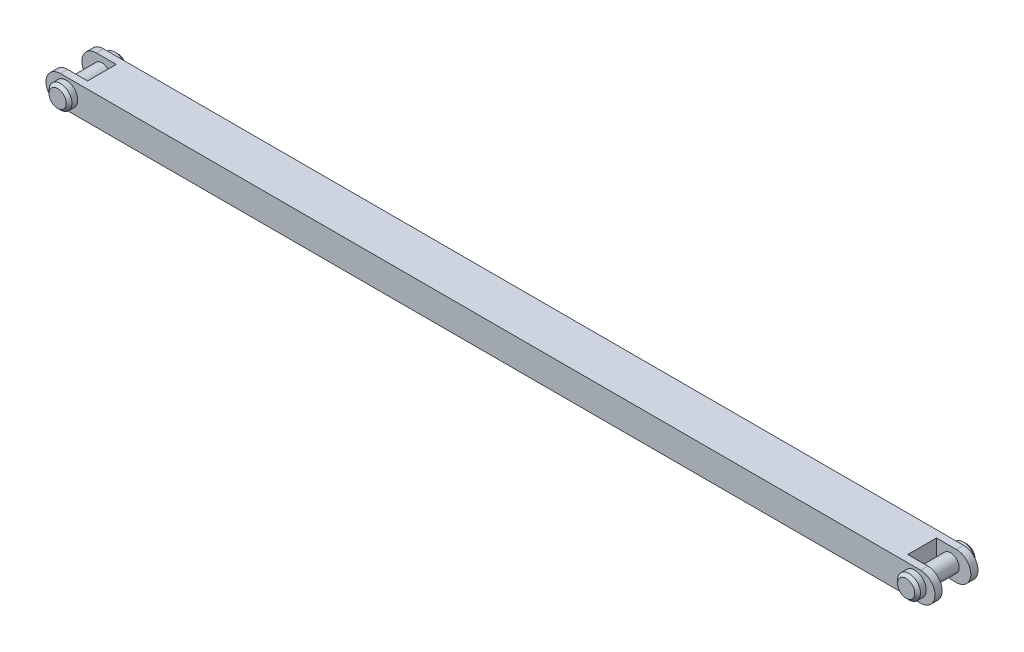
ISO-10303-21;
HEADER;
FILE_DESCRIPTION(('STEP AP214'),'2;1');
FILE_NAME('part.step','',(''),(''),'','','');
FILE_SCHEMA(('AUTOMOTIVE_DESIGN { 1 0 10303 214 1 1 1 1 }'));
ENDSEC;
DATA;
#1=APPLICATION_CONTEXT('core data for automotive mechanical design processes');
#2=APPLICATION_PROTOCOL_DEFINITION('international standard','automotive_design',2000,#1);
#3=PRODUCT_CONTEXT('',#1,'mechanical');
#4=PRODUCT('Part','Part','',(#3));
#5=PRODUCT_RELATED_PRODUCT_CATEGORY('part','',(#4));
#6=PRODUCT_DEFINITION_FORMATION('','',#4);
#7=PRODUCT_DEFINITION_CONTEXT('part definition',#1,'design');
#8=PRODUCT_DEFINITION('design','',#6,#7);
#9=PRODUCT_DEFINITION_SHAPE('','',#8);
#10=(LENGTH_UNIT() NAMED_UNIT(*) SI_UNIT(.MILLI.,.METRE.));
#11=(NAMED_UNIT(*) PLANE_ANGLE_UNIT() SI_UNIT($,.RADIAN.));
#12=(NAMED_UNIT(*) SI_UNIT($,.STERADIAN.) SOLID_ANGLE_UNIT());
#13=UNCERTAINTY_MEASURE_WITH_UNIT(LENGTH_MEASURE(1.E-05),#10,'distance_accuracy_value','');
#14=(GEOMETRIC_REPRESENTATION_CONTEXT(3) GLOBAL_UNCERTAINTY_ASSIGNED_CONTEXT((#13)) GLOBAL_UNIT_ASSIGNED_CONTEXT((#10,
#11,#12)) REPRESENTATION_CONTEXT('',''));
#15=CARTESIAN_POINT('',(0.,0.,0.));
#16=DIRECTION('',(0.,0.,1.));
#17=DIRECTION('',(1.,0.,0.));
#18=AXIS2_PLACEMENT_3D('',#15,#16,#17);
#19=CARTESIAN_POINT('',(5.,5.,15.));
#20=DIRECTION('',(0.,0.,-1.));
#21=DIRECTION('',(-1.,0.,0.));
#22=AXIS2_PLACEMENT_3D('',#19,#20,#21);
#23=CYLINDRICAL_SURFACE('',#22,5.);
#24=DIRECTION('',(0.,0.,-1.));
#25=VECTOR('',#24,1.);
#26=CARTESIAN_POINT('',(5.,0.,15.));
#27=LINE('',#26,#25);
#28=CARTESIAN_POINT('',(5.,0.,2.5));
#29=VERTEX_POINT('',#28);
#30=CARTESIAN_POINT('',(5.,0.,0.));
#31=VERTEX_POINT('',#30);
#32=EDGE_CURVE('E152',#29,#31,#27,.T.);
#33=ORIENTED_EDGE('',*,*,#32,.F.);
#34=CARTESIAN_POINT('',(5.,5.,2.5));
#35=DIRECTION('',(0.,0.,-1.));
#36=DIRECTION('',(-1.,0.,0.));
#37=AXIS2_PLACEMENT_3D('',#34,#35,#36);
#38=CIRCLE('',#37,5.);
#39=CARTESIAN_POINT('',(5.,10.,2.5));
#40=VERTEX_POINT('',#39);
#41=EDGE_CURVE('E148',#40,#29,#38,.F.);
#42=ORIENTED_EDGE('',*,*,#41,.F.);
#43=DIRECTION('',(0.,0.,-1.));
#44=VECTOR('',#43,1.);
#45=CARTESIAN_POINT('',(5.,10.,15.));
#46=LINE('',#45,#44);
#47=CARTESIAN_POINT('',(5.,10.,0.));
#48=VERTEX_POINT('',#47);
#49=EDGE_CURVE('E442',#40,#48,#46,.T.);
#50=ORIENTED_EDGE('',*,*,#49,.T.);
#51=CARTESIAN_POINT('',(5.,5.,0.));
#52=DIRECTION('',(0.,0.,1.));
#53=DIRECTION('',(-1.,0.,0.));
#54=AXIS2_PLACEMENT_3D('',#51,#52,#53);
#55=CIRCLE('',#54,5.);
#56=EDGE_CURVE('E131',#48,#31,#55,.T.);
#57=ORIENTED_EDGE('',*,*,#56,.T.);
#58=EDGE_LOOP('',(#33,#42,#50,#57));
#59=FACE_BOUND('',#58,.T.);
#60=ADVANCED_FACE('F39',(#59),#23,.T.);
#61=CARTESIAN_POINT('',(305.,5.,15.));
#62=DIRECTION('',(0.,0.,-1.));
#63=DIRECTION('',(-1.,0.,0.));
#64=AXIS2_PLACEMENT_3D('',#61,#62,#63);
#65=CYLINDRICAL_SURFACE('',#64,5.);
#66=DIRECTION('',(0.,0.,-1.));
#67=VECTOR('',#66,1.);
#68=CARTESIAN_POINT('',(305.,0.,15.));
#69=LINE('',#68,#67);
#70=CARTESIAN_POINT('',(305.,0.,15.));
#71=VERTEX_POINT('',#70);
#72=CARTESIAN_POINT('',(305.,0.,12.4999999999998));
#73=VERTEX_POINT('',#72);
#74=EDGE_CURVE('E157',#71,#73,#69,.T.);
#75=ORIENTED_EDGE('',*,*,#74,.T.);
#76=CARTESIAN_POINT('',(305.,5.,12.4999999999998));
#77=DIRECTION('',(0.,0.,1.));
#78=DIRECTION('',(1.,0.,0.));
#79=AXIS2_PLACEMENT_3D('',#76,#77,#78);
#80=CIRCLE('',#79,5.);
#81=CARTESIAN_POINT('',(305.,10.,12.4999999999998));
#82=VERTEX_POINT('',#81);
#83=EDGE_CURVE('E477',#82,#73,#80,.F.);
#84=ORIENTED_EDGE('',*,*,#83,.F.);
#85=DIRECTION('',(0.,0.,-1.));
#86=VECTOR('',#85,1.);
#87=CARTESIAN_POINT('',(305.,10.,15.));
#88=LINE('',#87,#86);
#89=CARTESIAN_POINT('',(305.,10.,15.));
#90=VERTEX_POINT('',#89);
#91=EDGE_CURVE('E446',#90,#82,#88,.T.);
#92=ORIENTED_EDGE('',*,*,#91,.F.);
#93=CARTESIAN_POINT('',(305.,5.,15.));
#94=DIRECTION('',(0.,0.,1.));
#95=DIRECTION('',(1.,0.,0.));
#96=AXIS2_PLACEMENT_3D('',#93,#94,#95);
#97=CIRCLE('',#96,5.);
#98=EDGE_CURVE('E431',#71,#90,#97,.T.);
#99=ORIENTED_EDGE('',*,*,#98,.F.);
#100=EDGE_LOOP('',(#75,#84,#92,#99));
#101=FACE_BOUND('',#100,.T.);
#102=ADVANCED_FACE('F216',(#101),#65,.T.);
#103=CARTESIAN_POINT('',(5.,10.,15.));
#104=VERTEX_POINT('',#103);
#105=CARTESIAN_POINT('',(5.,10.,12.5));
#106=VERTEX_POINT('',#105);
#107=EDGE_CURVE('E144',#104,#106,#46,.T.);
#108=ORIENTED_EDGE('',*,*,#107,.T.);
#109=CARTESIAN_POINT('',(5.,5.,12.5));
#110=DIRECTION('',(0.,0.,1.));
#111=DIRECTION('',(1.,0.,0.));
#112=AXIS2_PLACEMENT_3D('',#109,#110,#111);
#113=CIRCLE('',#112,5.);
#114=CARTESIAN_POINT('',(5.,0.,12.5));
#115=VERTEX_POINT('',#114);
#116=EDGE_CURVE('E64',#115,#106,#113,.F.);
#117=ORIENTED_EDGE('',*,*,#116,.F.);
#118=CARTESIAN_POINT('',(5.,0.,15.));
#119=VERTEX_POINT('',#118);
#120=EDGE_CURVE('E141',#119,#115,#27,.T.);
#121=ORIENTED_EDGE('',*,*,#120,.F.);
#122=CARTESIAN_POINT('',(5.,5.,15.));
#123=DIRECTION('',(0.,0.,1.));
#124=DIRECTION('',(-1.,0.,0.));
#125=AXIS2_PLACEMENT_3D('',#122,#123,#124);
#126=CIRCLE('',#125,5.);
#127=EDGE_CURVE('E426',#104,#119,#126,.T.);
#128=ORIENTED_EDGE('',*,*,#127,.F.);
#129=EDGE_LOOP('',(#108,#117,#121,#128));
#130=FACE_BOUND('',#129,.T.);
#131=ADVANCED_FACE('F143',(#130),#23,.T.);
#132=CARTESIAN_POINT('',(5.,0.,15.));
#133=DIRECTION('',(0.,1.,0.));
#134=DIRECTION('',(0.,0.,1.));
#135=AXIS2_PLACEMENT_3D('',#132,#133,#134);
#136=PLANE('',#135);
#137=DIRECTION('',(0.,0.,1.));
#138=VECTOR('',#137,1.);
#139=CARTESIAN_POINT('',(12.,0.,2.49999999999999));
#140=LINE('',#139,#138);
#141=CARTESIAN_POINT('',(12.,0.,2.49999999999999));
#142=VERTEX_POINT('',#141);
#143=CARTESIAN_POINT('',(12.,0.,12.5));
#144=VERTEX_POINT('',#143);
#145=EDGE_CURVE('E501',#142,#144,#140,.T.);
#146=ORIENTED_EDGE('',*,*,#145,.F.);
#147=DIRECTION('',(1.,0.,0.));
#148=VECTOR('',#147,1.);
#149=CARTESIAN_POINT('',(0.,0.,2.5));
#150=LINE('',#149,#148);
#151=EDGE_CURVE('E505',#29,#142,#150,.T.);
#152=ORIENTED_EDGE('',*,*,#151,.F.);
#153=ORIENTED_EDGE('',*,*,#32,.T.);
#154=DIRECTION('',(1.,0.,0.));
#155=VECTOR('',#154,1.);
#156=CARTESIAN_POINT('',(5.,0.,0.));
#157=LINE('',#156,#155);
#158=CARTESIAN_POINT('',(305.,0.,0.));
#159=VERTEX_POINT('',#158);
#160=EDGE_CURVE('E441',#31,#159,#157,.T.);
#161=ORIENTED_EDGE('',*,*,#160,.T.);
#162=CARTESIAN_POINT('',(305.,0.,2.50000000000009));
#163=VERTEX_POINT('',#162);
#164=EDGE_CURVE('E451',#163,#159,#69,.T.);
#165=ORIENTED_EDGE('',*,*,#164,.F.);
#166=DIRECTION('',(1.,0.,0.));
#167=VECTOR('',#166,1.);
#168=CARTESIAN_POINT('',(310.,0.,2.50000000000009));
#169=LINE('',#168,#167);
#170=CARTESIAN_POINT('',(298.,0.,2.50000000000009));
#171=VERTEX_POINT('',#170);
#172=EDGE_CURVE('E150',#171,#163,#169,.T.);
#173=ORIENTED_EDGE('',*,*,#172,.F.);
#174=DIRECTION('',(0.,0.,-1.));
#175=VECTOR('',#174,1.);
#176=CARTESIAN_POINT('',(298.,0.,2.50000000000009));
#177=LINE('',#176,#175);
#178=CARTESIAN_POINT('',(298.,0.,12.4999999999998));
#179=VERTEX_POINT('',#178);
#180=EDGE_CURVE('E485',#179,#171,#177,.T.);
#181=ORIENTED_EDGE('',*,*,#180,.F.);
#182=DIRECTION('',(-1.,0.,0.));
#183=VECTOR('',#182,1.);
#184=CARTESIAN_POINT('',(310.,0.,12.4999999999998));
#185=LINE('',#184,#183);
#186=EDGE_CURVE('E484',#73,#179,#185,.T.);
#187=ORIENTED_EDGE('',*,*,#186,.F.);
#188=ORIENTED_EDGE('',*,*,#74,.F.);
#189=DIRECTION('',(1.,0.,0.));
#190=VECTOR('',#189,1.);
#191=CARTESIAN_POINT('',(5.,0.,15.));
#192=LINE('',#191,#190);
#193=EDGE_CURVE('E151',#119,#71,#192,.T.);
#194=ORIENTED_EDGE('',*,*,#193,.F.);
#195=ORIENTED_EDGE('',*,*,#120,.T.);
#196=DIRECTION('',(-1.,0.,0.));
#197=VECTOR('',#196,1.);
#198=CARTESIAN_POINT('',(0.,0.,12.5));
#199=LINE('',#198,#197);
#200=EDGE_CURVE('E129',#144,#115,#199,.T.);
#201=ORIENTED_EDGE('',*,*,#200,.F.);
#202=EDGE_LOOP('',(#146,#152,#153,#161,#165,#173,#181,#187,#188,#194,#195,#201));
#203=FACE_BOUND('',#202,.T.);
#204=ADVANCED_FACE('F149',(#203),#136,.F.);
#205=CARTESIAN_POINT('',(305.,10.,2.50000000000009));
#206=VERTEX_POINT('',#205);
#207=CARTESIAN_POINT('',(305.,10.,0.));
#208=VERTEX_POINT('',#207);
#209=EDGE_CURVE('E450',#206,#208,#88,.T.);
#210=ORIENTED_EDGE('',*,*,#209,.F.);
#211=CARTESIAN_POINT('',(305.,5.,2.50000000000009));
#212=DIRECTION('',(0.,0.,-1.));
#213=DIRECTION('',(-1.,0.,0.));
#214=AXIS2_PLACEMENT_3D('',#211,#212,#213);
#215=CIRCLE('',#214,5.);
#216=EDGE_CURVE('E53',#163,#206,#215,.F.);
#217=ORIENTED_EDGE('',*,*,#216,.F.);
#218=ORIENTED_EDGE('',*,*,#164,.T.);
#219=CARTESIAN_POINT('',(305.,5.,0.));
#220=DIRECTION('',(0.,0.,1.));
#221=DIRECTION('',(1.,0.,0.));
#222=AXIS2_PLACEMENT_3D('',#219,#220,#221);
#223=CIRCLE('',#222,5.);
#224=EDGE_CURVE('E432',#159,#208,#223,.T.);
#225=ORIENTED_EDGE('',*,*,#224,.T.);
#226=EDGE_LOOP('',(#210,#217,#218,#225));
#227=FACE_BOUND('',#226,.T.);
#228=ADVANCED_FACE('F221',(#227),#65,.T.);
#229=CARTESIAN_POINT('',(5.,10.,15.));
#230=DIRECTION('',(0.,-1.,0.));
#231=DIRECTION('',(1.,0.,0.));
#232=AXIS2_PLACEMENT_3D('',#229,#230,#231);
#233=PLANE('',#232);
#234=ORIENTED_EDGE('',*,*,#49,.F.);
#235=DIRECTION('',(-1.,0.,0.));
#236=VECTOR('',#235,1.);
#237=CARTESIAN_POINT('',(0.,10.,2.5));
#238=LINE('',#237,#236);
#239=CARTESIAN_POINT('',(12.,10.,2.49999999999999));
#240=VERTEX_POINT('',#239);
#241=EDGE_CURVE('E470',#240,#40,#238,.T.);
#242=ORIENTED_EDGE('',*,*,#241,.F.);
#243=DIRECTION('',(0.,0.,-1.));
#244=VECTOR('',#243,1.);
#245=CARTESIAN_POINT('',(12.,10.,2.49999999999999));
#246=LINE('',#245,#244);
#247=CARTESIAN_POINT('',(12.,10.,12.5));
#248=VERTEX_POINT('',#247);
#249=EDGE_CURVE('E467',#248,#240,#246,.T.);
#250=ORIENTED_EDGE('',*,*,#249,.F.);
#251=DIRECTION('',(1.,0.,0.));
#252=VECTOR('',#251,1.);
#253=CARTESIAN_POINT('',(0.,10.,12.5));
#254=LINE('',#253,#252);
#255=EDGE_CURVE('E475',#106,#248,#254,.T.);
#256=ORIENTED_EDGE('',*,*,#255,.F.);
#257=ORIENTED_EDGE('',*,*,#107,.F.);
#258=DIRECTION('',(-1.,0.,0.));
#259=VECTOR('',#258,1.);
#260=CARTESIAN_POINT('',(5.,10.,15.));
#261=LINE('',#260,#259);
#262=EDGE_CURVE('E428',#90,#104,#261,.T.);
#263=ORIENTED_EDGE('',*,*,#262,.F.);
#264=ORIENTED_EDGE('',*,*,#91,.T.);
#265=DIRECTION('',(1.,0.,0.));
#266=VECTOR('',#265,1.);
#267=CARTESIAN_POINT('',(310.,10.,12.4999999999998));
#268=LINE('',#267,#266);
#269=CARTESIAN_POINT('',(298.,10.,12.4999999999998));
#270=VERTEX_POINT('',#269);
#271=EDGE_CURVE('E495',#270,#82,#268,.T.);
#272=ORIENTED_EDGE('',*,*,#271,.F.);
#273=DIRECTION('',(0.,0.,1.));
#274=VECTOR('',#273,1.);
#275=CARTESIAN_POINT('',(298.,10.,2.50000000000009));
#276=LINE('',#275,#274);
#277=CARTESIAN_POINT('',(298.,10.,2.50000000000009));
#278=VERTEX_POINT('',#277);
#279=EDGE_CURVE('E487',#278,#270,#276,.T.);
#280=ORIENTED_EDGE('',*,*,#279,.F.);
#281=DIRECTION('',(-1.,0.,0.));
#282=VECTOR('',#281,1.);
#283=CARTESIAN_POINT('',(310.,10.,2.50000000000009));
#284=LINE('',#283,#282);
#285=EDGE_CURVE('E458',#206,#278,#284,.T.);
#286=ORIENTED_EDGE('',*,*,#285,.F.);
#287=ORIENTED_EDGE('',*,*,#209,.T.);
#288=DIRECTION('',(-1.,0.,0.));
#289=VECTOR('',#288,1.);
#290=CARTESIAN_POINT('',(5.,10.,0.));
#291=LINE('',#290,#289);
#292=EDGE_CURVE('E427',#208,#48,#291,.T.);
#293=ORIENTED_EDGE('',*,*,#292,.T.);
#294=EDGE_LOOP('',(#234,#242,#250,#256,#257,#263,#264,#272,#280,#286,#287,#293));
#295=FACE_BOUND('',#294,.T.);
#296=ADVANCED_FACE('F232',(#295),#233,.F.);
#297=CARTESIAN_POINT('',(5.,5.,15.));
#298=DIRECTION('',(0.,0.,-1.));
#299=DIRECTION('',(-1.,0.,0.));
#300=AXIS2_PLACEMENT_3D('',#297,#298,#299);
#301=PLANE('',#300);
#302=CARTESIAN_POINT('',(302.945128947068,5.00000000000005,15.));
#303=DIRECTION('',(0.,0.,-1.));
#304=DIRECTION('',(-1.,0.,0.));
#305=AXIS2_PLACEMENT_3D('',#302,#303,#304);
#306=CIRCLE('',#305,3.99999999999999);
#307=CARTESIAN_POINT('',(298.945128947068,5.00000000000005,15.));
#308=VERTEX_POINT('',#307);
#309=EDGE_CURVE('E175',#308,#308,#306,.F.);
#310=ORIENTED_EDGE('',*,*,#309,.F.);
#311=EDGE_LOOP('',(#310));
#312=FACE_BOUND('',#311,.T.);
#313=CARTESIAN_POINT('',(7.05487105293202,5.,15.));
#314=DIRECTION('',(0.,0.,-1.));
#315=DIRECTION('',(-1.,0.,0.));
#316=AXIS2_PLACEMENT_3D('',#313,#314,#315);
#317=CIRCLE('',#316,4.);
#318=CARTESIAN_POINT('',(3.05487105293202,5.,15.));
#319=VERTEX_POINT('',#318);
#320=EDGE_CURVE('E173',#319,#319,#317,.F.);
#321=ORIENTED_EDGE('',*,*,#320,.F.);
#322=EDGE_LOOP('',(#321));
#323=FACE_BOUND('',#322,.T.);
#324=ORIENTED_EDGE('',*,*,#127,.T.);
#325=ORIENTED_EDGE('',*,*,#193,.T.);
#326=ORIENTED_EDGE('',*,*,#98,.T.);
#327=ORIENTED_EDGE('',*,*,#262,.T.);
#328=EDGE_LOOP('',(#324,#325,#326,#327));
#329=FACE_BOUND('',#328,.T.);
#330=ADVANCED_FACE('F238',(#312,#323,#329),#301,.F.);
#331=CARTESIAN_POINT('',(5.,5.,0.));
#332=DIRECTION('',(0.,0.,-1.));
#333=DIRECTION('',(-1.,0.,0.));
#334=AXIS2_PLACEMENT_3D('',#331,#332,#333);
#335=PLANE('',#334);
#336=CARTESIAN_POINT('',(302.945128947068,5.00000000000005,0.));
#337=DIRECTION('',(0.,0.,-1.));
#338=DIRECTION('',(-1.,0.,0.));
#339=AXIS2_PLACEMENT_3D('',#336,#337,#338);
#340=CIRCLE('',#339,3.99999999999999);
#341=CARTESIAN_POINT('',(298.945128947068,5.00000000000005,0.));
#342=VERTEX_POINT('',#341);
#343=EDGE_CURVE('E191',#342,#342,#340,.T.);
#344=ORIENTED_EDGE('',*,*,#343,.F.);
#345=EDGE_LOOP('',(#344));
#346=FACE_BOUND('',#345,.T.);
#347=CARTESIAN_POINT('',(7.05487105293202,5.,0.));
#348=DIRECTION('',(0.,0.,-1.));
#349=DIRECTION('',(-1.,0.,0.));
#350=AXIS2_PLACEMENT_3D('',#347,#348,#349);
#351=CIRCLE('',#350,4.);
#352=CARTESIAN_POINT('',(3.05487105293202,5.,0.));
#353=VERTEX_POINT('',#352);
#354=EDGE_CURVE('E190',#353,#353,#351,.T.);
#355=ORIENTED_EDGE('',*,*,#354,.F.);
#356=EDGE_LOOP('',(#355));
#357=FACE_BOUND('',#356,.T.);
#358=ORIENTED_EDGE('',*,*,#56,.F.);
#359=ORIENTED_EDGE('',*,*,#292,.F.);
#360=ORIENTED_EDGE('',*,*,#224,.F.);
#361=ORIENTED_EDGE('',*,*,#160,.F.);
#362=EDGE_LOOP('',(#358,#359,#360,#361));
#363=FACE_BOUND('',#362,.T.);
#364=ADVANCED_FACE('F244',(#346,#357,#363),#335,.T.);
#365=CARTESIAN_POINT('',(310.,-0.001000000000001,12.4999999999998));
#366=DIRECTION('',(0.,0.,1.));
#367=DIRECTION('',(1.,0.,0.));
#368=AXIS2_PLACEMENT_3D('',#365,#366,#367);
#369=PLANE('',#368);
#370=CARTESIAN_POINT('',(302.945128947068,5.00000000000005,12.4999999999998));
#371=DIRECTION('',(0.,0.,1.));
#372=DIRECTION('',(1.,0.,0.));
#373=AXIS2_PLACEMENT_3D('',#370,#371,#372);
#374=CIRCLE('',#373,2.99999999999999);
#375=CARTESIAN_POINT('',(305.945128947068,5.00000000000005,12.4999999999998));
#376=VERTEX_POINT('',#375);
#377=EDGE_CURVE('E169',#376,#376,#374,.F.);
#378=ORIENTED_EDGE('',*,*,#377,.F.);
#379=EDGE_LOOP('',(#378));
#380=FACE_BOUND('',#379,.T.);
#381=ORIENTED_EDGE('',*,*,#186,.T.);
#382=DIRECTION('',(0.,1.,0.));
#383=VECTOR('',#382,1.);
#384=CARTESIAN_POINT('',(298.,-0.001000000000001,12.4999999999998));
#385=LINE('',#384,#383);
#386=EDGE_CURVE('E494',#179,#270,#385,.T.);
#387=ORIENTED_EDGE('',*,*,#386,.T.);
#388=ORIENTED_EDGE('',*,*,#271,.T.);
#389=ORIENTED_EDGE('',*,*,#83,.T.);
#390=EDGE_LOOP('',(#381,#387,#388,#389));
#391=FACE_BOUND('',#390,.T.);
#392=ADVANCED_FACE('F241',(#380,#391),#369,.F.);
#393=CARTESIAN_POINT('',(298.,-0.001000000000001,2.50000000000009));
#394=DIRECTION('',(-1.,0.,0.));
#395=DIRECTION('',(0.,0.,1.));
#396=AXIS2_PLACEMENT_3D('',#393,#394,#395);
#397=PLANE('',#396);
#398=ORIENTED_EDGE('',*,*,#180,.T.);
#399=DIRECTION('',(0.,1.,0.));
#400=VECTOR('',#399,1.);
#401=CARTESIAN_POINT('',(298.,-0.001000000000001,2.50000000000009));
#402=LINE('',#401,#400);
#403=EDGE_CURVE('E493',#171,#278,#402,.T.);
#404=ORIENTED_EDGE('',*,*,#403,.T.);
#405=ORIENTED_EDGE('',*,*,#279,.T.);
#406=ORIENTED_EDGE('',*,*,#386,.F.);
#407=EDGE_LOOP('',(#398,#404,#405,#406));
#408=FACE_BOUND('',#407,.T.);
#409=ADVANCED_FACE('F255',(#408),#397,.F.);
#410=CARTESIAN_POINT('',(310.,-0.001000000000001,2.50000000000009));
#411=DIRECTION('',(0.,0.,-1.));
#412=DIRECTION('',(-1.,0.,0.));
#413=AXIS2_PLACEMENT_3D('',#410,#411,#412);
#414=PLANE('',#413);
#415=CARTESIAN_POINT('',(302.945128947068,5.00000000000005,2.50000000000009));
#416=DIRECTION('',(0.,0.,-1.));
#417=DIRECTION('',(-1.,0.,0.));
#418=AXIS2_PLACEMENT_3D('',#415,#416,#417);
#419=CIRCLE('',#418,2.99999999999999);
#420=CARTESIAN_POINT('',(299.945128947068,5.00000000000005,2.50000000000009));
#421=VERTEX_POINT('',#420);
#422=EDGE_CURVE('E164',#421,#421,#419,.F.);
#423=ORIENTED_EDGE('',*,*,#422,.F.);
#424=EDGE_LOOP('',(#423));
#425=FACE_BOUND('',#424,.T.);
#426=ORIENTED_EDGE('',*,*,#172,.T.);
#427=ORIENTED_EDGE('',*,*,#216,.T.);
#428=ORIENTED_EDGE('',*,*,#285,.T.);
#429=ORIENTED_EDGE('',*,*,#403,.F.);
#430=EDGE_LOOP('',(#426,#427,#428,#429));
#431=FACE_BOUND('',#430,.T.);
#432=ADVANCED_FACE('F247',(#425,#431),#414,.F.);
#433=CARTESIAN_POINT('',(0.,-0.001000000000001,2.5));
#434=DIRECTION('',(0.,0.,-1.));
#435=DIRECTION('',(-1.,0.,0.));
#436=AXIS2_PLACEMENT_3D('',#433,#434,#435);
#437=PLANE('',#436);
#438=CARTESIAN_POINT('',(7.05487105293202,5.,2.5));
#439=DIRECTION('',(0.,0.,-1.));
#440=DIRECTION('',(-1.,0.,0.));
#441=AXIS2_PLACEMENT_3D('',#438,#439,#440);
#442=CIRCLE('',#441,3.);
#443=CARTESIAN_POINT('',(4.05487105293202,5.,2.5));
#444=VERTEX_POINT('',#443);
#445=EDGE_CURVE('E160',#444,#444,#442,.F.);
#446=ORIENTED_EDGE('',*,*,#445,.F.);
#447=EDGE_LOOP('',(#446));
#448=FACE_BOUND('',#447,.T.);
#449=ORIENTED_EDGE('',*,*,#41,.T.);
#450=ORIENTED_EDGE('',*,*,#151,.T.);
#451=DIRECTION('',(0.,1.,0.));
#452=VECTOR('',#451,1.);
#453=CARTESIAN_POINT('',(12.,-0.001000000000001,2.49999999999999));
#454=LINE('',#453,#452);
#455=EDGE_CURVE('E139',#142,#240,#454,.T.);
#456=ORIENTED_EDGE('',*,*,#455,.T.);
#457=ORIENTED_EDGE('',*,*,#241,.T.);
#458=EDGE_LOOP('',(#449,#450,#456,#457));
#459=FACE_BOUND('',#458,.T.);
#460=ADVANCED_FACE('F251',(#448,#459),#437,.F.);
#461=CARTESIAN_POINT('',(12.,-0.001000000000001,2.49999999999999));
#462=DIRECTION('',(1.,0.,0.));
#463=DIRECTION('',(0.,0.,-1.));
#464=AXIS2_PLACEMENT_3D('',#461,#462,#463);
#465=PLANE('',#464);
#466=ORIENTED_EDGE('',*,*,#145,.T.);
#467=DIRECTION('',(0.,1.,0.));
#468=VECTOR('',#467,1.);
#469=CARTESIAN_POINT('',(12.,-0.001000000000001,12.5));
#470=LINE('',#469,#468);
#471=EDGE_CURVE('E133',#144,#248,#470,.T.);
#472=ORIENTED_EDGE('',*,*,#471,.T.);
#473=ORIENTED_EDGE('',*,*,#249,.T.);
#474=ORIENTED_EDGE('',*,*,#455,.F.);
#475=EDGE_LOOP('',(#466,#472,#473,#474));
#476=FACE_BOUND('',#475,.T.);
#477=ADVANCED_FACE('F264',(#476),#465,.F.);
#478=CARTESIAN_POINT('',(0.,-0.001000000000001,12.5));
#479=DIRECTION('',(0.,0.,1.));
#480=DIRECTION('',(1.,0.,0.));
#481=AXIS2_PLACEMENT_3D('',#478,#479,#480);
#482=PLANE('',#481);
#483=CARTESIAN_POINT('',(7.05487105293202,5.,12.5));
#484=DIRECTION('',(0.,0.,1.));
#485=DIRECTION('',(1.,0.,0.));
#486=AXIS2_PLACEMENT_3D('',#483,#484,#485);
#487=CIRCLE('',#486,3.);
#488=CARTESIAN_POINT('',(10.054871052932,5.,12.5));
#489=VERTEX_POINT('',#488);
#490=EDGE_CURVE('E153',#489,#489,#487,.F.);
#491=ORIENTED_EDGE('',*,*,#490,.F.);
#492=EDGE_LOOP('',(#491));
#493=FACE_BOUND('',#492,.T.);
#494=ORIENTED_EDGE('',*,*,#255,.T.);
#495=ORIENTED_EDGE('',*,*,#471,.F.);
#496=ORIENTED_EDGE('',*,*,#200,.T.);
#497=ORIENTED_EDGE('',*,*,#116,.T.);
#498=EDGE_LOOP('',(#494,#495,#496,#497));
#499=FACE_BOUND('',#498,.T.);
#500=ADVANCED_FACE('F128',(#493,#499),#482,.F.);
#501=CARTESIAN_POINT('',(7.05487105293202,5.,15.002));
#502=DIRECTION('',(0.,0.,-1.));
#503=DIRECTION('',(-1.,0.,0.));
#504=AXIS2_PLACEMENT_3D('',#501,#502,#503);
#505=CYLINDRICAL_SURFACE('',#504,3.);
#506=ORIENTED_EDGE('',*,*,#445,.T.);
#507=EDGE_LOOP('',(#506));
#508=FACE_BOUND('',#507,.T.);
#509=ORIENTED_EDGE('',*,*,#490,.T.);
#510=EDGE_LOOP('',(#509));
#511=FACE_BOUND('',#510,.T.);
#512=ADVANCED_FACE('F262',(#508,#511),#505,.T.);
#513=CARTESIAN_POINT('',(302.945128947068,5.00000000000005,15.002));
#514=DIRECTION('',(0.,0.,-1.));
#515=DIRECTION('',(-1.,0.,0.));
#516=AXIS2_PLACEMENT_3D('',#513,#514,#515);
#517=CYLINDRICAL_SURFACE('',#516,2.99999999999999);
#518=ORIENTED_EDGE('',*,*,#422,.T.);
#519=EDGE_LOOP('',(#518));
#520=FACE_BOUND('',#519,.T.);
#521=ORIENTED_EDGE('',*,*,#377,.T.);
#522=EDGE_LOOP('',(#521));
#523=FACE_BOUND('',#522,.T.);
#524=ADVANCED_FACE('F274',(#520,#523),#517,.T.);
#525=CARTESIAN_POINT('',(7.05487105293202,5.,18.));
#526=DIRECTION('',(0.,0.,-1.));
#527=DIRECTION('',(-1.,0.,0.));
#528=AXIS2_PLACEMENT_3D('',#525,#526,#527);
#529=CYLINDRICAL_SURFACE('',#528,4.);
#530=CARTESIAN_POINT('',(7.05487105293202,5.,17.));
#531=DIRECTION('',(0.,0.,1.));
#532=DIRECTION('',(1.,0.,0.));
#533=AXIS2_PLACEMENT_3D('',#530,#531,#532);
#534=CIRCLE('',#533,4.);
#535=CARTESIAN_POINT('',(11.054871052932,5.,17.));
#536=VERTEX_POINT('',#535);
#537=EDGE_CURVE('E177',#536,#536,#534,.F.);
#538=ORIENTED_EDGE('',*,*,#537,.T.);
#539=EDGE_LOOP('',(#538));
#540=FACE_BOUND('',#539,.T.);
#541=ORIENTED_EDGE('',*,*,#320,.T.);
#542=EDGE_LOOP('',(#541));
#543=FACE_BOUND('',#542,.T.);
#544=ADVANCED_FACE('F276',(#540,#543),#529,.T.);
#545=CARTESIAN_POINT('',(7.05487105293202,5.,18.));
#546=DIRECTION('',(0.,0.,1.));
#547=DIRECTION('',(1.,0.,0.));
#548=AXIS2_PLACEMENT_3D('',#545,#546,#547);
#549=PLANE('',#548);
#550=CARTESIAN_POINT('',(7.05487105293202,5.,18.));
#551=DIRECTION('',(0.,0.,1.));
#552=DIRECTION('',(1.,0.,0.));
#553=AXIS2_PLACEMENT_3D('',#550,#551,#552);
#554=CIRCLE('',#553,2.99999999999998);
#555=CARTESIAN_POINT('',(10.054871052932,5.,18.));
#556=VERTEX_POINT('',#555);
#557=EDGE_CURVE('E176',#556,#556,#554,.T.);
#558=ORIENTED_EDGE('',*,*,#557,.T.);
#559=EDGE_LOOP('',(#558));
#560=FACE_BOUND('',#559,.T.);
#561=ADVANCED_FACE('F282',(#560),#549,.T.);
#562=CARTESIAN_POINT('',(302.945128947068,5.00000000000005,18.));
#563=DIRECTION('',(0.,0.,-1.));
#564=DIRECTION('',(-1.,0.,0.));
#565=AXIS2_PLACEMENT_3D('',#562,#563,#564);
#566=CYLINDRICAL_SURFACE('',#565,3.99999999999999);
#567=CARTESIAN_POINT('',(302.945128947068,5.00000000000005,17.));
#568=DIRECTION('',(0.,0.,1.));
#569=DIRECTION('',(1.,0.,0.));
#570=AXIS2_PLACEMENT_3D('',#567,#568,#569);
#571=CIRCLE('',#570,3.99999999999999);
#572=CARTESIAN_POINT('',(306.945128947068,5.00000000000005,17.));
#573=VERTEX_POINT('',#572);
#574=EDGE_CURVE('E188',#573,#573,#571,.F.);
#575=ORIENTED_EDGE('',*,*,#574,.T.);
#576=EDGE_LOOP('',(#575));
#577=FACE_BOUND('',#576,.T.);
#578=ORIENTED_EDGE('',*,*,#309,.T.);
#579=EDGE_LOOP('',(#578));
#580=FACE_BOUND('',#579,.T.);
#581=ADVANCED_FACE('F286',(#577,#580),#566,.T.);
#582=CARTESIAN_POINT('',(302.945128947068,5.00000000000005,18.));
#583=DIRECTION('',(0.,0.,1.));
#584=DIRECTION('',(1.,0.,0.));
#585=AXIS2_PLACEMENT_3D('',#582,#583,#584);
#586=PLANE('',#585);
#587=CARTESIAN_POINT('',(302.945128947068,5.00000000000005,18.));
#588=DIRECTION('',(0.,0.,1.));
#589=DIRECTION('',(1.,0.,0.));
#590=AXIS2_PLACEMENT_3D('',#587,#588,#589);
#591=CIRCLE('',#590,3.);
#592=CARTESIAN_POINT('',(305.945128947068,5.00000000000005,18.));
#593=VERTEX_POINT('',#592);
#594=EDGE_CURVE('E181',#593,#593,#591,.T.);
#595=ORIENTED_EDGE('',*,*,#594,.T.);
#596=EDGE_LOOP('',(#595));
#597=FACE_BOUND('',#596,.T.);
#598=ADVANCED_FACE('F292',(#597),#586,.T.);
#599=CARTESIAN_POINT('',(7.05487105293202,5.,18.));
#600=DIRECTION('',(0.,0.,-1.));
#601=DIRECTION('',(-1.,0.,0.));
#602=AXIS2_PLACEMENT_3D('',#599,#600,#601);
#603=CONICAL_SURFACE('',#602,2.99999999999998,0.785398163397456);
#604=ORIENTED_EDGE('',*,*,#537,.F.);
#605=EDGE_LOOP('',(#604));
#606=FACE_BOUND('',#605,.T.);
#607=ORIENTED_EDGE('',*,*,#557,.F.);
#608=EDGE_LOOP('',(#607));
#609=FACE_BOUND('',#608,.T.);
#610=ADVANCED_FACE('F293',(#606,#609),#603,.T.);
#611=CARTESIAN_POINT('',(302.945128947068,5.00000000000005,18.));
#612=DIRECTION('',(0.,0.,-1.));
#613=DIRECTION('',(-1.,0.,0.));
#614=AXIS2_PLACEMENT_3D('',#611,#612,#613);
#615=CONICAL_SURFACE('',#614,3.,0.785398163397441);
#616=ORIENTED_EDGE('',*,*,#574,.F.);
#617=EDGE_LOOP('',(#616));
#618=FACE_BOUND('',#617,.T.);
#619=ORIENTED_EDGE('',*,*,#594,.F.);
#620=EDGE_LOOP('',(#619));
#621=FACE_BOUND('',#620,.T.);
#622=ADVANCED_FACE('F304',(#618,#621),#615,.T.);
#623=CARTESIAN_POINT('',(7.05487105293202,5.,-3.00000000000001));
#624=DIRECTION('',(0.,0.,1.));
#625=DIRECTION('',(1.,0.,0.));
#626=AXIS2_PLACEMENT_3D('',#623,#624,#625);
#627=CYLINDRICAL_SURFACE('',#626,4.);
#628=CARTESIAN_POINT('',(7.05487105293202,5.,-1.99999999999999));
#629=DIRECTION('',(0.,0.,-1.));
#630=DIRECTION('',(-1.,0.,0.));
#631=AXIS2_PLACEMENT_3D('',#628,#629,#630);
#632=CIRCLE('',#631,4.);
#633=CARTESIAN_POINT('',(3.05487105293202,5.,-1.99999999999999));
#634=VERTEX_POINT('',#633);
#635=EDGE_CURVE('E192',#634,#634,#632,.F.);
#636=ORIENTED_EDGE('',*,*,#635,.T.);
#637=EDGE_LOOP('',(#636));
#638=FACE_BOUND('',#637,.T.);
#639=ORIENTED_EDGE('',*,*,#354,.T.);
#640=EDGE_LOOP('',(#639));
#641=FACE_BOUND('',#640,.T.);
#642=ADVANCED_FACE('F299',(#638,#641),#627,.T.);
#643=CARTESIAN_POINT('',(7.05487105293202,5.,-3.00000000000001));
#644=DIRECTION('',(0.,0.,-1.));
#645=DIRECTION('',(1.,0.,0.));
#646=AXIS2_PLACEMENT_3D('',#643,#644,#645);
#647=PLANE('',#646);
#648=CARTESIAN_POINT('',(7.05487105293202,5.,-3.00000000000001));
#649=DIRECTION('',(0.,0.,-1.));
#650=DIRECTION('',(-1.,0.,0.));
#651=AXIS2_PLACEMENT_3D('',#648,#649,#650);
#652=CIRCLE('',#651,2.99999999999999);
#653=CARTESIAN_POINT('',(4.05487105293203,5.,-3.00000000000001));
#654=VERTEX_POINT('',#653);
#655=EDGE_CURVE('E196',#654,#654,#652,.T.);
#656=ORIENTED_EDGE('',*,*,#655,.T.);
#657=EDGE_LOOP('',(#656));
#658=FACE_BOUND('',#657,.T.);
#659=ADVANCED_FACE('F296',(#658),#647,.T.);
#660=CARTESIAN_POINT('',(302.945128947068,5.00000000000005,-3.00000000000001));
#661=DIRECTION('',(0.,0.,1.));
#662=DIRECTION('',(1.,0.,0.));
#663=AXIS2_PLACEMENT_3D('',#660,#661,#662);
#664=CYLINDRICAL_SURFACE('',#663,3.99999999999999);
#665=CARTESIAN_POINT('',(302.945128947068,5.00000000000005,-1.99999999999999));
#666=DIRECTION('',(0.,0.,-1.));
#667=DIRECTION('',(-1.,0.,0.));
#668=AXIS2_PLACEMENT_3D('',#665,#666,#667);
#669=CIRCLE('',#668,3.99999999999999);
#670=CARTESIAN_POINT('',(298.945128947068,5.00000000000005,-1.99999999999999));
#671=VERTEX_POINT('',#670);
#672=EDGE_CURVE('E50',#671,#671,#669,.F.);
#673=ORIENTED_EDGE('',*,*,#672,.T.);
#674=EDGE_LOOP('',(#673));
#675=FACE_BOUND('',#674,.T.);
#676=ORIENTED_EDGE('',*,*,#343,.T.);
#677=EDGE_LOOP('',(#676));
#678=FACE_BOUND('',#677,.T.);
#679=ADVANCED_FACE('F201',(#675,#678),#664,.T.);
#680=CARTESIAN_POINT('',(302.945128947068,5.00000000000005,-3.00000000000001));
#681=DIRECTION('',(0.,0.,-1.));
#682=DIRECTION('',(1.,0.,0.));
#683=AXIS2_PLACEMENT_3D('',#680,#681,#682);
#684=PLANE('',#683);
#685=CARTESIAN_POINT('',(302.945128947068,5.00000000000005,-3.00000000000001));
#686=DIRECTION('',(0.,0.,-1.));
#687=DIRECTION('',(-1.,0.,0.));
#688=AXIS2_PLACEMENT_3D('',#685,#686,#687);
#689=CIRCLE('',#688,3.);
#690=CARTESIAN_POINT('',(299.945128947068,5.00000000000005,-3.00000000000001));
#691=VERTEX_POINT('',#690);
#692=EDGE_CURVE('E11',#691,#691,#689,.T.);
#693=ORIENTED_EDGE('',*,*,#692,.T.);
#694=EDGE_LOOP('',(#693));
#695=FACE_BOUND('',#694,.T.);
#696=ADVANCED_FACE('F215',(#695),#684,.T.);
#697=CARTESIAN_POINT('',(7.05487105293202,5.,-1.99999999999999));
#698=DIRECTION('',(0.,0.,1.));
#699=DIRECTION('',(1.,0.,0.));
#700=AXIS2_PLACEMENT_3D('',#697,#698,#699);
#701=CONICAL_SURFACE('',#700,4.,0.785398163397443);
#702=ORIENTED_EDGE('',*,*,#655,.F.);
#703=EDGE_LOOP('',(#702));
#704=FACE_BOUND('',#703,.T.);
#705=ORIENTED_EDGE('',*,*,#635,.F.);
#706=EDGE_LOOP('',(#705));
#707=FACE_BOUND('',#706,.T.);
#708=ADVANCED_FACE('F210',(#704,#707),#701,.T.);
#709=CARTESIAN_POINT('',(302.945128947068,5.00000000000005,-1.99999999999999));
#710=DIRECTION('',(0.,0.,1.));
#711=DIRECTION('',(1.,0.,0.));
#712=AXIS2_PLACEMENT_3D('',#709,#710,#711);
#713=CONICAL_SURFACE('',#712,3.99999999999999,0.785398163397434);
#714=ORIENTED_EDGE('',*,*,#692,.F.);
#715=EDGE_LOOP('',(#714));
#716=FACE_BOUND('',#715,.T.);
#717=ORIENTED_EDGE('',*,*,#672,.F.);
#718=EDGE_LOOP('',(#717));
#719=FACE_BOUND('',#718,.T.);
#720=ADVANCED_FACE('F41',(#716,#719),#713,.T.);
#721=CLOSED_SHELL('',(#60,#102,#131,#204,#228,#296,#330,#364,#392,#409,#432,#460,#477,#500,#512,
#524,#544,#561,#581,#598,#610,#622,#642,#659,#679,#696,#708,#720));
#722=MANIFOLD_SOLID_BREP('B2',#721);
#723=ADVANCED_BREP_SHAPE_REPRESENTATION('',(#18,#722),#14);
#724=SHAPE_DEFINITION_REPRESENTATION(#9,#723);
ENDSEC;
END-ISO-10303-21;
